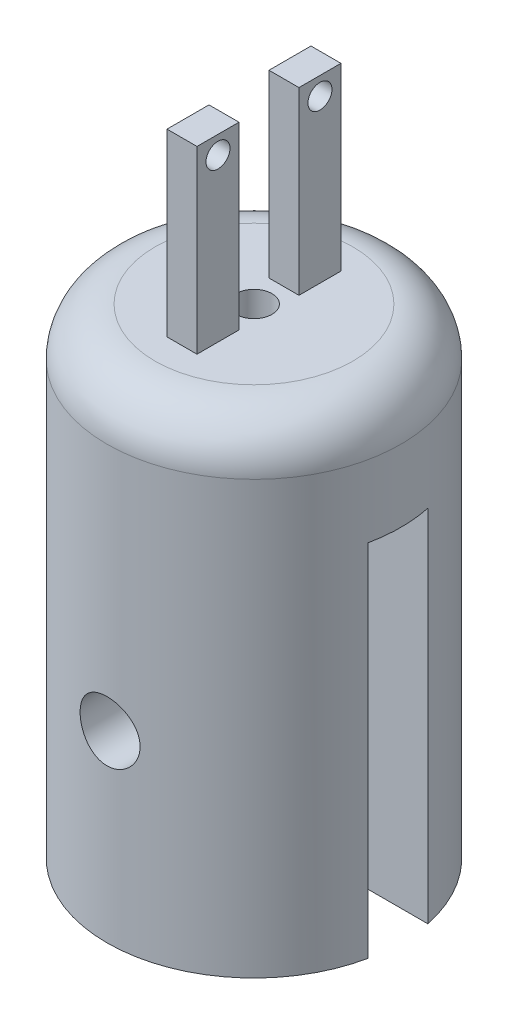
ISO-10303-21;
HEADER;
FILE_DESCRIPTION(('STEP AP214'),'2;1');
FILE_NAME('part.step','',(''),(''),'','','');
FILE_SCHEMA(('AUTOMOTIVE_DESIGN { 1 0 10303 214 1 1 1 1 }'));
ENDSEC;
DATA;
#1=APPLICATION_CONTEXT('core data for automotive mechanical design processes');
#2=APPLICATION_PROTOCOL_DEFINITION('international standard','automotive_design',2000,#1);
#3=PRODUCT_CONTEXT('',#1,'mechanical');
#4=PRODUCT('Part','Part','',(#3));
#5=PRODUCT_RELATED_PRODUCT_CATEGORY('part','',(#4));
#6=PRODUCT_DEFINITION_FORMATION('','',#4);
#7=PRODUCT_DEFINITION_CONTEXT('part definition',#1,'design');
#8=PRODUCT_DEFINITION('design','',#6,#7);
#9=PRODUCT_DEFINITION_SHAPE('','',#8);
#10=(LENGTH_UNIT() NAMED_UNIT(*) SI_UNIT(.MILLI.,.METRE.));
#11=(NAMED_UNIT(*) PLANE_ANGLE_UNIT() SI_UNIT($,.RADIAN.));
#12=(NAMED_UNIT(*) SI_UNIT($,.STERADIAN.) SOLID_ANGLE_UNIT());
#13=UNCERTAINTY_MEASURE_WITH_UNIT(LENGTH_MEASURE(1.E-05),#10,'distance_accuracy_value','');
#14=(GEOMETRIC_REPRESENTATION_CONTEXT(3) GLOBAL_UNCERTAINTY_ASSIGNED_CONTEXT((#13)) GLOBAL_UNIT_ASSIGNED_CONTEXT((#10,
#11,#12)) REPRESENTATION_CONTEXT('',''));
#15=CARTESIAN_POINT('',(0.,0.,0.));
#16=DIRECTION('',(0.,0.,1.));
#17=DIRECTION('',(1.,0.,0.));
#18=AXIS2_PLACEMENT_3D('',#15,#16,#17);
#19=CARTESIAN_POINT('',(0.,80.,0.));
#20=DIRECTION('',(0.,1.,0.));
#21=DIRECTION('',(0.,0.,1.));
#22=AXIS2_PLACEMENT_3D('',#19,#20,#21);
#23=PLANE('',#22);
#24=DIRECTION('',(0.,0.,-1.));
#25=VECTOR('',#24,1.);
#26=CARTESIAN_POINT('',(-2.5,80.,5.));
#27=LINE('',#26,#25);
#28=CARTESIAN_POINT('',(-2.5,80.,12.));
#29=VERTEX_POINT('',#28);
#30=CARTESIAN_POINT('',(-2.5,80.,5.));
#31=VERTEX_POINT('',#30);
#32=EDGE_CURVE('E130',#29,#31,#27,.T.);
#33=ORIENTED_EDGE('',*,*,#32,.T.);
#34=DIRECTION('',(1.,0.,0.));
#35=VECTOR('',#34,1.);
#36=CARTESIAN_POINT('',(-2.5,80.,5.));
#37=LINE('',#36,#35);
#38=CARTESIAN_POINT('',(2.5,80.,5.));
#39=VERTEX_POINT('',#38);
#40=EDGE_CURVE('E144',#31,#39,#37,.T.);
#41=ORIENTED_EDGE('',*,*,#40,.T.);
#42=DIRECTION('',(0.,0.,1.));
#43=VECTOR('',#42,1.);
#44=CARTESIAN_POINT('',(2.5,80.,5.));
#45=LINE('',#44,#43);
#46=CARTESIAN_POINT('',(2.5,80.,12.));
#47=VERTEX_POINT('',#46);
#48=EDGE_CURVE('E57',#39,#47,#45,.T.);
#49=ORIENTED_EDGE('',*,*,#48,.T.);
#50=DIRECTION('',(-1.,0.,0.));
#51=VECTOR('',#50,1.);
#52=CARTESIAN_POINT('',(-2.5,80.,12.));
#53=LINE('',#52,#51);
#54=EDGE_CURVE('E52',#47,#29,#53,.T.);
#55=ORIENTED_EDGE('',*,*,#54,.T.);
#56=EDGE_LOOP('',(#33,#41,#49,#55));
#57=FACE_BOUND('',#56,.T.);
#58=CARTESIAN_POINT('',(0.,80.,0.));
#59=DIRECTION('',(0.,1.,0.));
#60=DIRECTION('',(0.,0.,1.));
#61=AXIS2_PLACEMENT_3D('',#58,#59,#60);
#62=CIRCLE('',#61,3.);
#63=CARTESIAN_POINT('',(0.,80.,3.));
#64=VERTEX_POINT('',#63);
#65=EDGE_CURVE('E195',#64,#64,#62,.T.);
#66=ORIENTED_EDGE('',*,*,#65,.F.);
#67=EDGE_LOOP('',(#66));
#68=FACE_BOUND('',#67,.T.);
#69=CARTESIAN_POINT('',(0.,80.,0.));
#70=DIRECTION('',(0.,1.,0.));
#71=DIRECTION('',(0.,0.,1.));
#72=AXIS2_PLACEMENT_3D('',#69,#70,#71);
#73=CIRCLE('',#72,16.5);
#74=CARTESIAN_POINT('',(0.,80.,16.5));
#75=VERTEX_POINT('',#74);
#76=EDGE_CURVE('E225',#75,#75,#73,.T.);
#77=ORIENTED_EDGE('',*,*,#76,.T.);
#78=EDGE_LOOP('',(#77));
#79=FACE_BOUND('',#78,.T.);
#80=DIRECTION('',(1.,0.,0.));
#81=VECTOR('',#80,1.);
#82=CARTESIAN_POINT('',(-2.5,80.,-5.));
#83=LINE('',#82,#81);
#84=CARTESIAN_POINT('',(-2.5,80.,-5.));
#85=VERTEX_POINT('',#84);
#86=CARTESIAN_POINT('',(2.5,80.,-5.));
#87=VERTEX_POINT('',#86);
#88=EDGE_CURVE('E180',#85,#87,#83,.T.);
#89=ORIENTED_EDGE('',*,*,#88,.F.);
#90=DIRECTION('',(0.,0.,1.));
#91=VECTOR('',#90,1.);
#92=CARTESIAN_POINT('',(-2.5,80.,-5.));
#93=LINE('',#92,#91);
#94=CARTESIAN_POINT('',(-2.5,80.,-12.));
#95=VERTEX_POINT('',#94);
#96=EDGE_CURVE('E177',#95,#85,#93,.T.);
#97=ORIENTED_EDGE('',*,*,#96,.F.);
#98=DIRECTION('',(-1.,0.,0.));
#99=VECTOR('',#98,1.);
#100=CARTESIAN_POINT('',(-2.5,80.,-12.));
#101=LINE('',#100,#99);
#102=CARTESIAN_POINT('',(2.5,80.,-12.));
#103=VERTEX_POINT('',#102);
#104=EDGE_CURVE('E170',#103,#95,#101,.T.);
#105=ORIENTED_EDGE('',*,*,#104,.F.);
#106=DIRECTION('',(0.,0.,-1.));
#107=VECTOR('',#106,1.);
#108=CARTESIAN_POINT('',(2.5,80.,-5.));
#109=LINE('',#108,#107);
#110=EDGE_CURVE('E182',#87,#103,#109,.T.);
#111=ORIENTED_EDGE('',*,*,#110,.F.);
#112=EDGE_LOOP('',(#89,#97,#105,#111));
#113=FACE_BOUND('',#112,.T.);
#114=ADVANCED_FACE('F35',(#57,#68,#79,#113),#23,.T.);
#115=CARTESIAN_POINT('',(0.,80.,0.));
#116=DIRECTION('',(0.,-1.,0.));
#117=DIRECTION('',(0.,0.,-1.));
#118=AXIS2_PLACEMENT_3D('',#115,#116,#117);
#119=CYLINDRICAL_SURFACE('',#118,24.5);
#120=CARTESIAN_POINT('',(0.,35.57,-24.5));
#121=CARTESIAN_POINT('',(-0.138927094691041,35.5700028592022,-24.5000014764726));
#122=CARTESIAN_POINT('',(-0.277818744280451,35.5642083292908,-24.4988162973987));
#123=CARTESIAN_POINT('',(-0.554642589428666,35.5410818382895,-24.4941118465682));
#124=CARTESIAN_POINT('',(-0.692574602962235,35.5237477455675,-24.4905921435699));
#125=CARTESIAN_POINT('',(-0.966505720383131,35.4776645513688,-24.4813125826295));
#126=CARTESIAN_POINT('',(-1.10250384016258,35.4489098394028,-24.4755516236775));
#127=CARTESIAN_POINT('',(-1.37158796318948,35.3802010460337,-24.4619480034038));
#128=CARTESIAN_POINT('',(-1.50467287632139,35.3402428470112,-24.4541045767687));
#129=CARTESIAN_POINT('',(-1.76676806236914,35.249501817156,-24.436566048711));
#130=CARTESIAN_POINT('',(-1.89578363712136,35.1987338008121,-24.4268734833423));
#131=CARTESIAN_POINT('',(-2.14909431066194,35.0867001632099,-24.4058917710595));
#132=CARTESIAN_POINT('',(-2.27338764787567,35.0254306705734,-24.3946020356164));
#133=CARTESIAN_POINT('',(-2.51631455034081,34.892880833122,-24.3707417328443));
#134=CARTESIAN_POINT('',(-2.63495058326167,34.8216049075422,-24.3581717316004));
#135=CARTESIAN_POINT('',(-2.86588000793839,34.6694945895268,-24.3320825582598));
#136=CARTESIAN_POINT('',(-2.97817100739644,34.5886566269394,-24.3185630324118));
#137=CARTESIAN_POINT('',(-3.19695962959707,34.4169498005349,-24.2907752007784));
#138=CARTESIAN_POINT('',(-3.30336947418976,34.3259702279187,-24.2764997532354));
#139=CARTESIAN_POINT('',(-3.50821247878026,34.1353924390404,-24.2477452311264));
#140=CARTESIAN_POINT('',(-3.60664266800269,34.0357910412032,-24.2332660830567));
#141=CARTESIAN_POINT('',(-3.79479236215388,33.8286984930855,-24.2045162725873));
#142=CARTESIAN_POINT('',(-3.88451435106679,33.7212096081371,-24.190245551727));
#143=CARTESIAN_POINT('',(-4.05469560057424,33.4989997097404,-24.1623029369191));
#144=CARTESIAN_POINT('',(-4.13515143244166,33.3842760433738,-24.148631265788));
#145=CARTESIAN_POINT('',(-4.28689310747993,33.1473069515512,-24.122158725797));
#146=CARTESIAN_POINT('',(-4.35808820527605,33.0250022539705,-24.109366980361));
#147=CARTESIAN_POINT('',(-4.48992363251295,32.7746851332047,-24.0851626522282));
#148=CARTESIAN_POINT('',(-4.55055999989192,32.6466705899919,-24.0737505877323));
#149=CARTESIAN_POINT('',(-4.71582535517314,32.2554961878267,-24.0421242614682));
#150=CARTESIAN_POINT('',(-4.80399508441736,31.984917164341,-24.0244863951867));
#151=CARTESIAN_POINT('',(-4.9323490185101,31.4362262433694,-23.9984623215732));
#152=CARTESIAN_POINT('',(-4.97317067582927,31.1582672175011,-23.9899533313089));
#153=CARTESIAN_POINT('',(-5.00774249215697,30.5992863003403,-23.9827615421265));
#154=CARTESIAN_POINT('',(-5.00149766739469,30.3182647386329,-23.9840776960687));
#155=CARTESIAN_POINT('',(-4.94260278714393,29.765854376771,-23.9962814911304));
#156=CARTESIAN_POINT('',(-4.89068442200202,29.4943835840185,-24.00701820772));
#157=CARTESIAN_POINT('',(-4.74307866873316,28.9640853771568,-24.0366141367175));
#158=CARTESIAN_POINT('',(-4.64738911274848,28.7052585899706,-24.0554737514258));
#159=CARTESIAN_POINT('',(-4.41426261071955,28.2055013017009,-24.0993439484245));
#160=CARTESIAN_POINT('',(-4.2765375151849,27.9647090802306,-24.1243967517326));
#161=CARTESIAN_POINT('',(-3.96345306929938,27.5093792391972,-24.1778035624238));
#162=CARTESIAN_POINT('',(-3.78808922307917,27.2948447608774,-24.2061579639906));
#163=CARTESIAN_POINT('',(-3.40079730339449,26.8939008973363,-24.2636256176444));
#164=CARTESIAN_POINT('',(-3.18824528791539,26.7080942969021,-24.292743129691));
#165=CARTESIAN_POINT('',(-2.73467922207017,26.3746750840182,-24.3479699126631));
#166=CARTESIAN_POINT('',(-2.4936647773062,26.2270630009122,-24.3740791418936));
#167=CARTESIAN_POINT('',(-1.98933186888398,25.9741036721555,-24.4204158445337));
#168=CARTESIAN_POINT('',(-1.72597681353677,25.8688274525639,-24.4406334181132));
#169=CARTESIAN_POINT('',(-1.18481320306257,25.7041823475231,-24.4728340679864));
#170=CARTESIAN_POINT('',(-0.907006477108038,25.6448076672542,-24.484818183688));
#171=CARTESIAN_POINT('',(-0.350003377842166,25.5745093803965,-24.4990562051537));
#172=CARTESIAN_POINT('',(-0.0709151791141877,25.5627611799464,-24.5014756921779));
#173=CARTESIAN_POINT('',(0.485236190463291,25.5858256016683,-24.4967726244774));
#174=CARTESIAN_POINT('',(0.762299479106051,25.6206354934299,-24.4896506293152));
#175=CARTESIAN_POINT('',(1.30386085463528,25.7351431266972,-24.4667686320952));
#176=CARTESIAN_POINT('',(1.56845258336614,25.8144157830914,-24.4510904688367));
#177=CARTESIAN_POINT('',(2.08058737994473,26.015132705376,-24.4128482525639));
#178=CARTESIAN_POINT('',(2.32812912999591,26.1365802265975,-24.390283668027));
#179=CARTESIAN_POINT('',(2.80260055657824,26.4199691223475,-24.3403599107688));
#180=CARTESIAN_POINT('',(3.0292290845,26.5824044144471,-24.3129435726736));
#181=CARTESIAN_POINT('',(3.4523076081673,26.9424999128215,-24.2564879881501));
#182=CARTESIAN_POINT('',(3.64875422060733,27.1401640627928,-24.2274485602752));
#183=CARTESIAN_POINT('',(4.00909180962205,27.5688629585039,-24.1704584705477));
#184=CARTESIAN_POINT('',(4.17241562109737,27.8003782322776,-24.1425324546264));
#185=CARTESIAN_POINT('',(4.45785904295759,28.2880517914195,-24.0914634329602));
#186=CARTESIAN_POINT('',(4.57998033601114,28.5442090698842,-24.0683202319048));
#187=CARTESIAN_POINT('',(4.77879231716162,29.0725287660103,-24.029635797035));
#188=CARTESIAN_POINT('',(4.85572344197731,29.3445978510058,-24.0140544087063));
#189=CARTESIAN_POINT('',(4.96268020933427,29.8983123304613,-23.9921842453168));
#190=CARTESIAN_POINT('',(4.99271225463982,30.1799564123565,-23.9858942017876));
#191=CARTESIAN_POINT('',(5.00183412579818,30.6002589184671,-23.9839850414354));
#192=CARTESIAN_POINT('',(4.9990712097101,30.7387396937784,-23.9845643887607));
#193=CARTESIAN_POINT('',(4.98208019203428,31.0149513714852,-23.9881009184022));
#194=CARTESIAN_POINT('',(4.96785644779947,31.1526825388461,-23.9910571970195));
#195=CARTESIAN_POINT('',(4.92804499552794,31.4264611768382,-23.999266146514));
#196=CARTESIAN_POINT('',(4.90245332201172,31.5625080428973,-24.0045196187124));
#197=CARTESIAN_POINT('',(4.84012177233547,31.8318722568431,-24.017165384348));
#198=CARTESIAN_POINT('',(4.8033858691224,31.9651905594188,-24.0245569155182));
#199=CARTESIAN_POINT('',(4.71914246240962,32.2279151165449,-24.041246460658));
#200=CARTESIAN_POINT('',(4.67165988668527,32.3573296511157,-24.0505400579302));
#201=CARTESIAN_POINT('',(4.56624924075806,32.6116434429965,-24.07077574865));
#202=CARTESIAN_POINT('',(4.50832486046888,32.7365442766957,-24.0817172595356));
#203=CARTESIAN_POINT('',(4.38241080354131,32.9810991515731,-24.1049491476778));
#204=CARTESIAN_POINT('',(4.31441692121477,33.1007509732198,-24.1172400879876));
#205=CARTESIAN_POINT('',(4.16888258814234,33.3339283783887,-24.142822380248));
#206=CARTESIAN_POINT('',(4.09134540292377,33.447456038457,-24.1561133893932));
#207=CARTESIAN_POINT('',(3.92574901414531,33.6696840161423,-24.18358250611));
#208=CARTESIAN_POINT('',(3.83752518474707,33.7782602528297,-24.1977722937296));
#209=CARTESIAN_POINT('',(3.65234623613038,33.9875850593388,-24.2264140814968));
#210=CARTESIAN_POINT('',(3.55539418778792,34.0883363591727,-24.2408659880045));
#211=CARTESIAN_POINT('',(3.35332512605612,34.2814352450307,-24.269644187054));
#212=CARTESIAN_POINT('',(3.24820331535755,34.3737778232577,-24.2839704002095));
#213=CARTESIAN_POINT('',(3.03058919604741,34.5493298209395,-24.3120866888451));
#214=CARTESIAN_POINT('',(2.91809961242228,34.6325425869527,-24.3258769595713));
#215=CARTESIAN_POINT('',(2.68514756581195,34.7901878545419,-24.3526976162421));
#216=CARTESIAN_POINT('',(2.56460892140556,34.8645096248866,-24.3657175652357));
#217=CARTESIAN_POINT('',(2.31760650666049,35.0026876637999,-24.3904509933865));
#218=CARTESIAN_POINT('',(2.19114493416003,35.0665477754572,-24.4021649517917));
#219=CARTESIAN_POINT('',(1.93321207454402,35.1833193628907,-24.4239518238109));
#220=CARTESIAN_POINT('',(1.8017438131856,35.236237330932,-24.4340257097648));
#221=CARTESIAN_POINT('',(1.53471428575054,35.3307477306037,-24.4522509673096));
#222=CARTESIAN_POINT('',(1.39915380137499,35.3723423102223,-24.4604027034833));
#223=CARTESIAN_POINT('',(1.05645121011035,35.4617263944715,-24.4780752457162));
#224=CARTESIAN_POINT('',(0.847304024589248,35.502272564655,-24.4862537360052));
#225=CARTESIAN_POINT('',(0.425410125130095,35.5564067170554,-24.4972148906169));
#226=CARTESIAN_POINT('',(0.212663534817133,35.569995623258,-24.4999977398802));
#227=CARTESIAN_POINT('',(0.,35.57,-24.5));
#228=B_SPLINE_CURVE_WITH_KNOTS('',3,(#120,#121,#122,#123,#124,#125,#126,#127,#128,#129,#130,
#131,#132,#133,#134,#135,#136,#137,#138,#139,#140,#141,#142,#143,#144,#145,#146,#147,#148,#149,
#150,#151,#152,#153,#154,#155,#156,#157,#158,#159,#160,#161,#162,#163,#164,#165,#166,#167,#168,
#169,#170,#171,#172,#173,#174,#175,#176,#177,#178,#179,#180,#181,#182,#183,#184,#185,#186,#187,
#188,#189,#190,#191,#192,#193,#194,#195,#196,#197,#198,#199,#200,#201,#202,#203,#204,#205,#206,
#207,#208,#209,#210,#211,#212,#213,#214,#215,#216,#217,#218,#219,#220,#221,#222,#223,#224,#225,
#226,#227),.UNSPECIFIED.,.T.,.F.,(4,2,2,2,2,2,2,2,2,2,2,2,2,2,2,2,2,2,2,2,2,2,2,2,2,2,2,2,2,2,2,
2,2,2,2,2,2,2,2,2,2,2,2,2,2,2,2,2,2,2,2,2,2,4),(0.,0.416594504688223,0.833265985670308,
1.25014241422477,1.66717225873678,2.08363421478996,2.50025003141825,2.9166824295262,
3.33327080357858,3.75496036745213,4.17680620954459,4.59853136572381,5.02041207355789,
5.44615711289273,5.87206156629022,6.72285181415668,7.56204971668844,8.40115818084931,
9.22706403167339,10.0530107916031,10.8847515773284,11.7165917680808,12.5640293536971,
13.4114786834545,14.2603438899074,15.1091019142383,15.9431003052891,16.7770497884504,
17.6031589832907,18.4293319568065,19.2659804091366,20.1027225790206,20.9527660774774,
21.8027748568254,22.6482191666779,23.493548044542,23.9086708866234,24.3236359753833,
24.7387459304,25.1537080712007,25.5677173632094,25.9815806388394,26.3956172611332,
26.8095126002117,27.2308768860665,27.6520934971281,28.0735593443185,28.4948701822124,
28.9209769347491,29.3469268043235,29.7726232166892,30.1982388202873,30.8359653700628,
31.4736700607815),.UNSPECIFIED.);
#229=CARTESIAN_POINT('',(0.,35.57,-24.5));
#230=VERTEX_POINT('',#229);
#231=EDGE_CURVE('E237',#230,#230,#228,.T.);
#232=ORIENTED_EDGE('',*,*,#231,.T.);
#233=EDGE_LOOP('',(#232));
#234=FACE_BOUND('',#233,.T.);
#235=CARTESIAN_POINT('',(5.,30.57,23.9843699104229));
#236=CARTESIAN_POINT('',(5.00000287031204,30.4311067880227,23.9843683164881));
#237=CARTESIAN_POINT('',(4.99421113527899,30.2922490351051,23.9855786307056));
#238=CARTESIAN_POINT('',(4.97109609504833,30.015493912437,23.9903804718701));
#239=CARTESIAN_POINT('',(4.95377065590898,29.8775967251799,23.9939724394651));
#240=CARTESIAN_POINT('',(4.90771111898821,29.6037359746018,24.003435586374));
#241=CARTESIAN_POINT('',(4.87897135749194,29.4677734059702,24.0093078971477));
#242=CARTESIAN_POINT('',(4.81029945110373,29.1987611709007,24.0231606132268));
#243=CARTESIAN_POINT('',(4.77036318434047,29.0657125967022,24.0311417948276));
#244=CARTESIAN_POINT('',(4.67967510731973,28.8036947472973,24.0489661116341));
#245=CARTESIAN_POINT('',(4.62893854881608,28.6747200110896,24.0588066189922));
#246=CARTESIAN_POINT('',(4.5169754628336,28.4214875988056,24.0800784625353));
#247=CARTESIAN_POINT('',(4.45574506526056,28.2972316837422,24.0915103853361));
#248=CARTESIAN_POINT('',(4.32327944568266,28.054373111214,24.1156335733153));
#249=CARTESIAN_POINT('',(4.25204860336977,27.9357680092699,24.1283242864965));
#250=CARTESIAN_POINT('',(4.10003266827963,27.7048921726436,24.1546203050691));
#251=CARTESIAN_POINT('',(4.01924400610569,27.5926238277087,24.1682259513212));
#252=CARTESIAN_POINT('',(3.84758698031475,27.3738056194171,24.1961511395995));
#253=CARTESIAN_POINT('',(3.75660246748283,27.2673477390398,24.2104776069987));
#254=CARTESIAN_POINT('',(3.56600462660314,27.0624081134423,24.2392842638956));
#255=CARTESIAN_POINT('',(3.46638811259692,26.9639293393786,24.2537645084052));
#256=CARTESIAN_POINT('',(3.25925562197385,26.7756844302855,24.2824664576735));
#257=CARTESIAN_POINT('',(3.15174197589191,26.6859157428151,24.2966882371749));
#258=CARTESIAN_POINT('',(2.92947288516401,26.5156444974405,24.324488484682));
#259=CARTESIAN_POINT('',(2.8147147865828,26.4351453662063,24.3380667137025));
#260=CARTESIAN_POINT('',(2.57771724515427,26.2833536943518,24.3643118474148));
#261=CARTESIAN_POINT('',(2.45542113788268,26.2121478529483,24.3769697407805));
#262=CARTESIAN_POINT('',(2.20512011512136,26.0802900389384,24.4008874822613));
#263=CARTESIAN_POINT('',(2.07711307951964,26.0196420274496,24.4121468052046));
#264=CARTESIAN_POINT('',(1.68596126221837,25.8543411806531,24.4433132310557));
#265=CARTESIAN_POINT('',(1.41539864565885,25.7661478186252,24.4606417586859));
#266=CARTESIAN_POINT('',(0.866773244548727,25.6377490945213,24.4861835000912));
#267=CARTESIAN_POINT('',(0.588864036984934,25.5969027191187,24.4945183660633));
#268=CARTESIAN_POINT('',(0.0299818092546762,25.5622641577462,24.5015736192865));
#269=CARTESIAN_POINT('',(-0.250990901206434,25.5684672585462,24.5002949695816));
#270=CARTESIAN_POINT('',(-0.803577192131904,25.6272930850394,24.4883557685608));
#271=CARTESIAN_POINT('',(-1.07526776927765,25.6792262793228,24.4778345843826));
#272=CARTESIAN_POINT('',(-1.6059977573131,25.8269367293049,24.4487513908128));
#273=CARTESIAN_POINT('',(-1.86503664696114,25.9227157897425,24.430189050441));
#274=CARTESIAN_POINT('',(-2.36506252464143,26.1560335052328,24.3868803469086));
#275=CARTESIAN_POINT('',(-2.60592077234362,26.2938404181068,24.3620944446702));
#276=CARTESIAN_POINT('',(-3.06134859720679,26.607102724614,24.3090680433033));
#277=CARTESIAN_POINT('',(-3.27591502623854,26.7825626198324,24.2808271312864));
#278=CARTESIAN_POINT('',(-3.67676176122547,27.1699266662662,24.2234025961596));
#279=CARTESIAN_POINT('',(-3.86245828860777,27.3824342321867,24.1942111653571));
#280=CARTESIAN_POINT('',(-4.19567604662687,27.8358708216587,24.1386603723479));
#281=CARTESIAN_POINT('',(-4.343196494427,28.0768004278837,24.1123010682233));
#282=CARTESIAN_POINT('',(-4.5960879436222,28.5811025080727,24.0653825020964));
#283=CARTESIAN_POINT('',(-4.70136112519516,28.844525373792,24.0448367328648));
#284=CARTESIAN_POINT('',(-4.86597976406629,29.3858374812179,24.0120669177334));
#285=CARTESIAN_POINT('',(-4.9253314770358,29.6637247469991,23.9998417383851));
#286=CARTESIAN_POINT('',(-4.99554298856658,30.2207773271084,23.9853252377806));
#287=CARTESIAN_POINT('',(-5.00724728283665,30.4998318115329,23.9828609376556));
#288=CARTESIAN_POINT('',(-4.98410710282828,31.0559055346767,23.987680413684));
#289=CARTESIAN_POINT('',(-4.94926538426934,31.3329248929076,23.9949636127446));
#290=CARTESIAN_POINT('',(-4.83475127606536,31.8742048696097,24.0182951758056));
#291=CARTESIAN_POINT('',(-4.75553303096808,32.1385657459594,24.0342546991666));
#292=CARTESIAN_POINT('',(-4.55500139154479,32.6502626646445,24.073062299938));
#293=CARTESIAN_POINT('',(-4.43368440841965,32.8975972533818,24.0959109646067));
#294=CARTESIAN_POINT('',(-4.15049846564737,33.3719074245406,24.1463091963637));
#295=CARTESIAN_POINT('',(-3.98810281422004,33.5985621039516,24.1739182093712));
#296=CARTESIAN_POINT('',(-3.62806767643758,34.0217115831825,24.2305645073036));
#297=CARTESIAN_POINT('',(-3.43042440578403,34.218203140373,24.2596019453461));
#298=CARTESIAN_POINT('',(-3.00171065011575,34.5786668605631,24.3163967347696));
#299=CARTESIAN_POINT('',(-2.77015495443473,34.7420670191573,24.3441260918958));
#300=CARTESIAN_POINT('',(-2.28237738577488,35.027644271138,24.3946871577373));
#301=CARTESIAN_POINT('',(-2.02615657613214,35.1498231405906,24.4175190774489));
#302=CARTESIAN_POINT('',(-1.49785378139559,35.3486678322095,24.455595754619));
#303=CARTESIAN_POINT('',(-1.22587460330765,35.425598644627,24.4708846004948));
#304=CARTESIAN_POINT('',(-0.672352338599459,35.5325852257849,24.4923335795426));
#305=CARTESIAN_POINT('',(-0.390810458283114,35.5626468846427,24.4984948597847));
#306=CARTESIAN_POINT('',(0.0294578185818548,35.571840659533,24.5003778998617));
#307=CARTESIAN_POINT('',(0.168003765761269,35.5690977919645,24.4998151129379));
#308=CARTESIAN_POINT('',(0.44434795360207,35.552135869253,24.4963584664674));
#309=CARTESIAN_POINT('',(0.582146458218647,35.5379211724691,24.4934654922026));
#310=CARTESIAN_POINT('',(0.856061377218716,35.4981163290979,24.4854234115053));
#311=CARTESIAN_POINT('',(0.992177194474289,35.4725222570801,24.4802735265374));
#312=CARTESIAN_POINT('',(1.26168033768967,35.4101737881419,24.4678635803065));
#313=CARTESIAN_POINT('',(1.39506862000967,35.3734233771757,24.4606042727409));
#314=CARTESIAN_POINT('',(1.65795462757969,35.2891313813696,24.4441914952869));
#315=CARTESIAN_POINT('',(1.78746002111646,35.2416129042145,24.4350420851182));
#316=CARTESIAN_POINT('',(2.04195023382489,35.1361150145816,24.4150921736591));
#317=CARTESIAN_POINT('',(2.16693663409939,35.0781393042364,24.4042922568969));
#318=CARTESIAN_POINT('',(2.41165349388574,34.9521088612283,24.381325628565));
#319=CARTESIAN_POINT('',(2.53138175261763,34.8840499594267,24.3691583521323));
#320=CARTESIAN_POINT('',(2.76470007438014,34.7383740622531,24.3437918488365));
#321=CARTESIAN_POINT('',(2.87829222260844,34.6607603436122,24.330592976313));
#322=CARTESIAN_POINT('',(3.10053299814342,34.4950773852655,24.3032805343235));
#323=CARTESIAN_POINT('',(3.2090637636233,34.4068519521149,24.2891551771405));
#324=CARTESIAN_POINT('',(3.41829623439949,34.2216792428967,24.2605935292818));
#325=CARTESIAN_POINT('',(3.51900067030696,34.1247350345136,24.2461573493178));
#326=CARTESIAN_POINT('',(3.71200641900073,33.9226911490237,24.2173602333125));
#327=CARTESIAN_POINT('',(3.80430266902993,33.8175866280325,24.2029993474475));
#328=CARTESIAN_POINT('',(3.97976413225426,33.6000167391411,24.1747672817949));
#329=CARTESIAN_POINT('',(4.06293268370979,33.4875540865008,24.1608959242405));
#330=CARTESIAN_POINT('',(4.2205190036678,33.2546268097432,24.1338701387341));
#331=CARTESIAN_POINT('',(4.29482290658945,33.1340839091486,24.1207260071028));
#332=CARTESIAN_POINT('',(4.43296505677975,32.8870755092854,24.095720536246));
#333=CARTESIAN_POINT('',(4.4968071471687,32.7606122069092,24.0838587265102));
#334=CARTESIAN_POINT('',(4.61354330725533,32.5026770881362,24.0617694716194));
#335=CARTESIAN_POINT('',(4.66644392449769,32.3712083231888,24.0515410498603));
#336=CARTESIAN_POINT('',(4.76092082566232,32.1041767915785,24.0330177385101));
#337=CARTESIAN_POINT('',(4.80249926726503,31.9686148104425,24.0247224805572));
#338=CARTESIAN_POINT('',(4.891819617289,31.6259995474248,24.0067312977789));
#339=CARTESIAN_POINT('',(4.93233058385396,31.4169432029953,23.9983929039452));
#340=CARTESIAN_POINT('',(4.98641807769568,30.9952301300801,23.9872135322741));
#341=CARTESIAN_POINT('',(4.9999956070396,30.7825735358397,23.9843723499111));
#342=CARTESIAN_POINT('',(5.,30.57,23.9843699104229));
#343=B_SPLINE_CURVE_WITH_KNOTS('',3,(#235,#236,#237,#238,#239,#240,#241,#242,#243,#244,#245,
#246,#247,#248,#249,#250,#251,#252,#253,#254,#255,#256,#257,#258,#259,#260,#261,#262,#263,#264,
#265,#266,#267,#268,#269,#270,#271,#272,#273,#274,#275,#276,#277,#278,#279,#280,#281,#282,#283,
#284,#285,#286,#287,#288,#289,#290,#291,#292,#293,#294,#295,#296,#297,#298,#299,#300,#301,#302,
#303,#304,#305,#306,#307,#308,#309,#310,#311,#312,#313,#314,#315,#316,#317,#318,#319,#320,#321,
#322,#323,#324,#325,#326,#327,#328,#329,#330,#331,#332,#333,#334,#335,#336,#337,#338,#339,#340,
#341,#342),.UNSPECIFIED.,.T.,.F.,(4,2,2,2,2,2,2,2,2,2,2,2,2,2,2,2,2,2,2,2,2,2,2,2,2,2,2,2,2,2,2,
2,2,2,2,2,2,2,2,2,2,2,2,2,2,2,2,2,2,2,2,2,2,4),(0.,0.416492716074513,0.833062512182578,
1.24983926635832,1.66676965427877,2.08311512948347,2.49961448328692,2.91593199703739,
3.33240547953886,3.75422882909918,4.17620853673013,4.5980642097702,5.02007533262015,
5.44577819146088,5.8716404241375,6.72235075738893,7.56140391847064,8.40037302764426,
9.22690447109253,10.0534699384475,10.8854257730249,11.7174811271707,12.5646314222936,
13.4117990876593,14.2609171318933,15.1099194842896,15.9438069472585,16.777645042774,
17.6031016515695,18.4286286455152,19.2653301572271,20.1021215540588,20.9523316288473,
21.8025050666865,22.6476486622237,23.4926860387235,23.9080030359055,24.3231623207496,
24.7384649302313,25.1536193340343,25.5678911369492,25.9820165637082,26.3963137009779,
26.8104691528231,27.231711922684,27.6528070546367,28.074154084336,28.4953464982159,
28.9214706618725,29.34743793728,29.7731495651086,30.1987800077011,30.8362382550597,
31.4736727851353),.UNSPECIFIED.);
#344=CARTESIAN_POINT('',(5.,30.57,23.9843699104229));
#345=VERTEX_POINT('',#344);
#346=EDGE_CURVE('E231',#345,#345,#343,.T.);
#347=ORIENTED_EDGE('',*,*,#346,.T.);
#348=EDGE_LOOP('',(#347));
#349=FACE_BOUND('',#348,.T.);
#350=CARTESIAN_POINT('',(0.,72.,0.));
#351=DIRECTION('',(0.,1.,0.));
#352=DIRECTION('',(0.,0.,1.));
#353=AXIS2_PLACEMENT_3D('',#350,#351,#352);
#354=CIRCLE('',#353,24.5);
#355=CARTESIAN_POINT('',(0.,72.,24.5));
#356=VERTEX_POINT('',#355);
#357=EDGE_CURVE('E228',#356,#356,#354,.F.);
#358=ORIENTED_EDGE('',*,*,#357,.T.);
#359=EDGE_LOOP('',(#358));
#360=FACE_BOUND('',#359,.T.);
#361=DIRECTION('',(0.,-1.,0.));
#362=VECTOR('',#361,1.);
#363=CARTESIAN_POINT('',(23.9843699104229,80.,-5.));
#364=LINE('',#363,#362);
#365=CARTESIAN_POINT('',(23.9843699104229,0.,-5.));
#366=VERTEX_POINT('',#365);
#367=CARTESIAN_POINT('',(23.9843699104229,60.,-5.));
#368=VERTEX_POINT('',#367);
#369=EDGE_CURVE('E217',#366,#368,#364,.F.);
#370=ORIENTED_EDGE('',*,*,#369,.F.);
#371=CARTESIAN_POINT('',(0.,0.,0.));
#372=DIRECTION('',(0.,1.,0.));
#373=DIRECTION('',(0.,0.,1.));
#374=AXIS2_PLACEMENT_3D('',#371,#372,#373);
#375=CIRCLE('',#374,24.5);
#376=CARTESIAN_POINT('',(-23.9843699104229,0.,-5.));
#377=VERTEX_POINT('',#376);
#378=EDGE_CURVE('E224',#366,#377,#375,.T.);
#379=ORIENTED_EDGE('',*,*,#378,.T.);
#380=DIRECTION('',(0.,-1.,0.));
#381=VECTOR('',#380,1.);
#382=CARTESIAN_POINT('',(-23.9843699104229,80.,-5.));
#383=LINE('',#382,#381);
#384=CARTESIAN_POINT('',(-23.9843699104229,60.,-5.));
#385=VERTEX_POINT('',#384);
#386=EDGE_CURVE('E219',#385,#377,#383,.T.);
#387=ORIENTED_EDGE('',*,*,#386,.F.);
#388=CARTESIAN_POINT('',(0.,60.,0.));
#389=DIRECTION('',(0.,-1.,0.));
#390=DIRECTION('',(0.,0.,-1.));
#391=AXIS2_PLACEMENT_3D('',#388,#389,#390);
#392=CIRCLE('',#391,24.5);
#393=CARTESIAN_POINT('',(-23.9843699104229,60.,5.));
#394=VERTEX_POINT('',#393);
#395=EDGE_CURVE('E44',#394,#385,#392,.T.);
#396=ORIENTED_EDGE('',*,*,#395,.F.);
#397=DIRECTION('',(0.,-1.,0.));
#398=VECTOR('',#397,1.);
#399=CARTESIAN_POINT('',(-23.9843699104229,80.,5.));
#400=LINE('',#399,#398);
#401=CARTESIAN_POINT('',(-23.9843699104229,0.,5.));
#402=VERTEX_POINT('',#401);
#403=EDGE_CURVE('E212',#402,#394,#400,.F.);
#404=ORIENTED_EDGE('',*,*,#403,.F.);
#405=CARTESIAN_POINT('',(23.9843699104229,0.,5.));
#406=VERTEX_POINT('',#405);
#407=EDGE_CURVE('E221',#402,#406,#375,.T.);
#408=ORIENTED_EDGE('',*,*,#407,.T.);
#409=DIRECTION('',(0.,-1.,0.));
#410=VECTOR('',#409,1.);
#411=CARTESIAN_POINT('',(23.9843699104229,80.,5.));
#412=LINE('',#411,#410);
#413=CARTESIAN_POINT('',(23.9843699104229,60.,5.));
#414=VERTEX_POINT('',#413);
#415=EDGE_CURVE('E214',#414,#406,#412,.T.);
#416=ORIENTED_EDGE('',*,*,#415,.F.);
#417=EDGE_CURVE('E11',#368,#414,#392,.T.);
#418=ORIENTED_EDGE('',*,*,#417,.F.);
#419=EDGE_LOOP('',(#370,#379,#387,#396,#404,#408,#416,#418));
#420=FACE_BOUND('',#419,.T.);
#421=ADVANCED_FACE('F241',(#234,#349,#360,#420),#119,.T.);
#422=CARTESIAN_POINT('',(0.,0.,0.));
#423=DIRECTION('',(0.,1.,0.));
#424=DIRECTION('',(0.,0.,1.));
#425=AXIS2_PLACEMENT_3D('',#422,#423,#424);
#426=PLANE('',#425);
#427=DIRECTION('',(-1.,0.,0.));
#428=VECTOR('',#427,1.);
#429=CARTESIAN_POINT('',(26.6563617468227,0.,-5.));
#430=LINE('',#429,#428);
#431=EDGE_CURVE('E207',#366,#377,#430,.T.);
#432=ORIENTED_EDGE('',*,*,#431,.T.);
#433=ORIENTED_EDGE('',*,*,#378,.F.);
#434=EDGE_LOOP('',(#432,#433));
#435=FACE_BOUND('',#434,.T.);
#436=ADVANCED_FACE('F256',(#435),#426,.F.);
#437=DIRECTION('',(1.,0.,0.));
#438=VECTOR('',#437,1.);
#439=CARTESIAN_POINT('',(26.6563617468227,0.,5.));
#440=LINE('',#439,#438);
#441=EDGE_CURVE('E203',#402,#406,#440,.T.);
#442=ORIENTED_EDGE('',*,*,#441,.T.);
#443=ORIENTED_EDGE('',*,*,#407,.F.);
#444=EDGE_LOOP('',(#442,#443));
#445=FACE_BOUND('',#444,.T.);
#446=ADVANCED_FACE('F250',(#445),#426,.F.);
#447=CARTESIAN_POINT('',(0.,30.57,-24.5));
#448=DIRECTION('',(0.,0.,1.));
#449=DIRECTION('',(1.,0.,0.));
#450=AXIS2_PLACEMENT_3D('',#447,#448,#449);
#451=CYLINDRICAL_SURFACE('',#450,5.);
#452=ORIENTED_EDGE('',*,*,#231,.F.);
#453=EDGE_LOOP('',(#452));
#454=FACE_BOUND('',#453,.T.);
#455=CARTESIAN_POINT('',(0.,30.57,-5.));
#456=DIRECTION('',(0.,0.,1.));
#457=DIRECTION('',(1.,0.,0.));
#458=AXIS2_PLACEMENT_3D('',#455,#456,#457);
#459=CIRCLE('',#458,5.);
#460=CARTESIAN_POINT('',(5.,30.57,-5.));
#461=VERTEX_POINT('',#460);
#462=EDGE_CURVE('E216',#461,#461,#459,.F.);
#463=ORIENTED_EDGE('',*,*,#462,.F.);
#464=EDGE_LOOP('',(#463));
#465=FACE_BOUND('',#464,.T.);
#466=ADVANCED_FACE('F244',(#454,#465),#451,.F.);
#467=ORIENTED_EDGE('',*,*,#346,.F.);
#468=EDGE_LOOP('',(#467));
#469=FACE_BOUND('',#468,.T.);
#470=CARTESIAN_POINT('',(0.,30.57,5.));
#471=DIRECTION('',(0.,0.,-1.));
#472=DIRECTION('',(-1.,0.,0.));
#473=AXIS2_PLACEMENT_3D('',#470,#471,#472);
#474=CIRCLE('',#473,5.);
#475=CARTESIAN_POINT('',(-5.,30.57,5.));
#476=VERTEX_POINT('',#475);
#477=EDGE_CURVE('E206',#476,#476,#474,.F.);
#478=ORIENTED_EDGE('',*,*,#477,.F.);
#479=EDGE_LOOP('',(#478));
#480=FACE_BOUND('',#479,.T.);
#481=ADVANCED_FACE('F249',(#469,#480),#451,.F.);
#482=CARTESIAN_POINT('',(0.,72.,0.));
#483=DIRECTION('',(0.,1.,0.));
#484=DIRECTION('',(0.,0.,1.));
#485=AXIS2_PLACEMENT_3D('',#482,#483,#484);
#486=TOROIDAL_SURFACE('',#485,16.5,8.);
#487=ORIENTED_EDGE('',*,*,#357,.F.);
#488=EDGE_LOOP('',(#487));
#489=FACE_BOUND('',#488,.T.);
#490=ORIENTED_EDGE('',*,*,#76,.F.);
#491=EDGE_LOOP('',(#490));
#492=FACE_BOUND('',#491,.T.);
#493=ADVANCED_FACE('F37',(#489,#492),#486,.T.);
#494=CARTESIAN_POINT('',(0.,60.,0.));
#495=DIRECTION('',(0.,-1.,0.));
#496=DIRECTION('',(0.,0.,-1.));
#497=AXIS2_PLACEMENT_3D('',#494,#495,#496);
#498=PLANE('',#497);
#499=CARTESIAN_POINT('',(0.,60.,0.));
#500=DIRECTION('',(0.,-1.,0.));
#501=DIRECTION('',(0.,0.,-1.));
#502=AXIS2_PLACEMENT_3D('',#499,#500,#501);
#503=CIRCLE('',#502,3.);
#504=CARTESIAN_POINT('',(0.,60.,-3.));
#505=VERTEX_POINT('',#504);
#506=EDGE_CURVE('E198',#505,#505,#503,.T.);
#507=ORIENTED_EDGE('',*,*,#506,.F.);
#508=EDGE_LOOP('',(#507));
#509=FACE_BOUND('',#508,.T.);
#510=ORIENTED_EDGE('',*,*,#417,.T.);
#511=DIRECTION('',(1.,0.,0.));
#512=VECTOR('',#511,1.);
#513=CARTESIAN_POINT('',(26.6563617468227,60.,5.));
#514=LINE('',#513,#512);
#515=EDGE_CURVE('E202',#394,#414,#514,.T.);
#516=ORIENTED_EDGE('',*,*,#515,.F.);
#517=ORIENTED_EDGE('',*,*,#395,.T.);
#518=DIRECTION('',(-1.,0.,0.));
#519=VECTOR('',#518,1.);
#520=CARTESIAN_POINT('',(26.6563617468227,60.,-5.));
#521=LINE('',#520,#519);
#522=EDGE_CURVE('E199',#368,#385,#521,.T.);
#523=ORIENTED_EDGE('',*,*,#522,.F.);
#524=EDGE_LOOP('',(#510,#516,#517,#523));
#525=FACE_BOUND('',#524,.T.);
#526=ADVANCED_FACE('F276',(#509,#525),#498,.T.);
#527=CARTESIAN_POINT('',(26.6563617468227,60.,-5.));
#528=DIRECTION('',(0.,0.,1.));
#529=DIRECTION('',(1.,0.,0.));
#530=AXIS2_PLACEMENT_3D('',#527,#528,#529);
#531=PLANE('',#530);
#532=ORIENTED_EDGE('',*,*,#462,.T.);
#533=EDGE_LOOP('',(#532));
#534=FACE_BOUND('',#533,.T.);
#535=ORIENTED_EDGE('',*,*,#386,.T.);
#536=ORIENTED_EDGE('',*,*,#431,.F.);
#537=ORIENTED_EDGE('',*,*,#369,.T.);
#538=ORIENTED_EDGE('',*,*,#522,.T.);
#539=EDGE_LOOP('',(#535,#536,#537,#538));
#540=FACE_BOUND('',#539,.T.);
#541=ADVANCED_FACE('F252',(#534,#540),#531,.T.);
#542=CARTESIAN_POINT('',(26.6563617468227,60.,5.));
#543=DIRECTION('',(0.,0.,-1.));
#544=DIRECTION('',(-1.,0.,0.));
#545=AXIS2_PLACEMENT_3D('',#542,#543,#544);
#546=PLANE('',#545);
#547=ORIENTED_EDGE('',*,*,#477,.T.);
#548=EDGE_LOOP('',(#547));
#549=FACE_BOUND('',#548,.T.);
#550=ORIENTED_EDGE('',*,*,#415,.T.);
#551=ORIENTED_EDGE('',*,*,#441,.F.);
#552=ORIENTED_EDGE('',*,*,#403,.T.);
#553=ORIENTED_EDGE('',*,*,#515,.T.);
#554=EDGE_LOOP('',(#550,#551,#552,#553));
#555=FACE_BOUND('',#554,.T.);
#556=ADVANCED_FACE('F321',(#549,#555),#546,.T.);
#557=CARTESIAN_POINT('',(0.,20.,0.));
#558=DIRECTION('',(0.,1.,0.));
#559=DIRECTION('',(0.,0.,1.));
#560=AXIS2_PLACEMENT_3D('',#557,#558,#559);
#561=CYLINDRICAL_SURFACE('',#560,3.);
#562=ORIENTED_EDGE('',*,*,#506,.T.);
#563=EDGE_LOOP('',(#562));
#564=FACE_BOUND('',#563,.T.);
#565=ORIENTED_EDGE('',*,*,#65,.T.);
#566=EDGE_LOOP('',(#565));
#567=FACE_BOUND('',#566,.T.);
#568=ADVANCED_FACE('F317',(#564,#567),#561,.F.);
#569=CARTESIAN_POINT('',(-2.5,110.,-5.));
#570=DIRECTION('',(1.,0.,0.));
#571=DIRECTION('',(0.,0.,-1.));
#572=AXIS2_PLACEMENT_3D('',#569,#570,#571);
#573=PLANE('',#572);
#574=CARTESIAN_POINT('',(-2.5,107.,-8.5));
#575=DIRECTION('',(-1.,0.,0.));
#576=DIRECTION('',(0.,0.,1.));
#577=AXIS2_PLACEMENT_3D('',#574,#575,#576);
#578=CIRCLE('',#577,2.);
#579=CARTESIAN_POINT('',(-2.5,107.,-6.5));
#580=VERTEX_POINT('',#579);
#581=EDGE_CURVE('E133',#580,#580,#578,.T.);
#582=ORIENTED_EDGE('',*,*,#581,.F.);
#583=EDGE_LOOP('',(#582));
#584=FACE_BOUND('',#583,.T.);
#585=ORIENTED_EDGE('',*,*,#96,.T.);
#586=DIRECTION('',(0.,-1.,0.));
#587=VECTOR('',#586,1.);
#588=CARTESIAN_POINT('',(-2.5,110.,-5.));
#589=LINE('',#588,#587);
#590=CARTESIAN_POINT('',(-2.5,110.,-5.));
#591=VERTEX_POINT('',#590);
#592=EDGE_CURVE('E193',#591,#85,#589,.T.);
#593=ORIENTED_EDGE('',*,*,#592,.F.);
#594=DIRECTION('',(0.,0.,1.));
#595=VECTOR('',#594,1.);
#596=CARTESIAN_POINT('',(-2.5,110.,-5.));
#597=LINE('',#596,#595);
#598=CARTESIAN_POINT('',(-2.5,110.,-12.));
#599=VERTEX_POINT('',#598);
#600=EDGE_CURVE('E166',#599,#591,#597,.T.);
#601=ORIENTED_EDGE('',*,*,#600,.F.);
#602=DIRECTION('',(0.,-1.,0.));
#603=VECTOR('',#602,1.);
#604=CARTESIAN_POINT('',(-2.5,110.,-12.));
#605=LINE('',#604,#603);
#606=EDGE_CURVE('E176',#599,#95,#605,.T.);
#607=ORIENTED_EDGE('',*,*,#606,.T.);
#608=EDGE_LOOP('',(#585,#593,#601,#607));
#609=FACE_BOUND('',#608,.T.);
#610=ADVANCED_FACE('F313',(#584,#609),#573,.F.);
#611=CARTESIAN_POINT('',(-2.5,110.,-5.));
#612=DIRECTION('',(0.,0.,-1.));
#613=DIRECTION('',(-1.,0.,0.));
#614=AXIS2_PLACEMENT_3D('',#611,#612,#613);
#615=PLANE('',#614);
#616=ORIENTED_EDGE('',*,*,#88,.T.);
#617=DIRECTION('',(0.,-1.,0.));
#618=VECTOR('',#617,1.);
#619=CARTESIAN_POINT('',(2.5,110.,-5.));
#620=LINE('',#619,#618);
#621=CARTESIAN_POINT('',(2.5,110.,-5.));
#622=VERTEX_POINT('',#621);
#623=EDGE_CURVE('E190',#622,#87,#620,.T.);
#624=ORIENTED_EDGE('',*,*,#623,.F.);
#625=DIRECTION('',(1.,0.,0.));
#626=VECTOR('',#625,1.);
#627=CARTESIAN_POINT('',(-2.5,110.,-5.));
#628=LINE('',#627,#626);
#629=EDGE_CURVE('E169',#591,#622,#628,.T.);
#630=ORIENTED_EDGE('',*,*,#629,.F.);
#631=ORIENTED_EDGE('',*,*,#592,.T.);
#632=EDGE_LOOP('',(#616,#624,#630,#631));
#633=FACE_BOUND('',#632,.T.);
#634=ADVANCED_FACE('F310',(#633),#615,.F.);
#635=CARTESIAN_POINT('',(2.5,110.,-5.));
#636=DIRECTION('',(-1.,0.,0.));
#637=DIRECTION('',(0.,0.,1.));
#638=AXIS2_PLACEMENT_3D('',#635,#636,#637);
#639=PLANE('',#638);
#640=CARTESIAN_POINT('',(2.5,107.,-8.5));
#641=DIRECTION('',(-1.,0.,0.));
#642=DIRECTION('',(0.,0.,1.));
#643=AXIS2_PLACEMENT_3D('',#640,#641,#642);
#644=CIRCLE('',#643,2.);
#645=CARTESIAN_POINT('',(2.5,107.,-6.5));
#646=VERTEX_POINT('',#645);
#647=EDGE_CURVE('E165',#646,#646,#644,.T.);
#648=ORIENTED_EDGE('',*,*,#647,.T.);
#649=EDGE_LOOP('',(#648));
#650=FACE_BOUND('',#649,.T.);
#651=ORIENTED_EDGE('',*,*,#110,.T.);
#652=DIRECTION('',(0.,-1.,0.));
#653=VECTOR('',#652,1.);
#654=CARTESIAN_POINT('',(2.5,110.,-12.));
#655=LINE('',#654,#653);
#656=CARTESIAN_POINT('',(2.5,110.,-12.));
#657=VERTEX_POINT('',#656);
#658=EDGE_CURVE('E188',#657,#103,#655,.T.);
#659=ORIENTED_EDGE('',*,*,#658,.F.);
#660=DIRECTION('',(0.,0.,-1.));
#661=VECTOR('',#660,1.);
#662=CARTESIAN_POINT('',(2.5,110.,-5.));
#663=LINE('',#662,#661);
#664=EDGE_CURVE('E172',#622,#657,#663,.T.);
#665=ORIENTED_EDGE('',*,*,#664,.F.);
#666=ORIENTED_EDGE('',*,*,#623,.T.);
#667=EDGE_LOOP('',(#651,#659,#665,#666));
#668=FACE_BOUND('',#667,.T.);
#669=ADVANCED_FACE('F286',(#650,#668),#639,.F.);
#670=CARTESIAN_POINT('',(-2.5,110.,-12.));
#671=DIRECTION('',(0.,0.,1.));
#672=DIRECTION('',(1.,0.,0.));
#673=AXIS2_PLACEMENT_3D('',#670,#671,#672);
#674=PLANE('',#673);
#675=ORIENTED_EDGE('',*,*,#104,.T.);
#676=ORIENTED_EDGE('',*,*,#606,.F.);
#677=DIRECTION('',(-1.,0.,0.));
#678=VECTOR('',#677,1.);
#679=CARTESIAN_POINT('',(-2.5,110.,-12.));
#680=LINE('',#679,#678);
#681=EDGE_CURVE('E174',#657,#599,#680,.T.);
#682=ORIENTED_EDGE('',*,*,#681,.F.);
#683=ORIENTED_EDGE('',*,*,#658,.T.);
#684=EDGE_LOOP('',(#675,#676,#682,#683));
#685=FACE_BOUND('',#684,.T.);
#686=ADVANCED_FACE('F300',(#685),#674,.F.);
#687=CARTESIAN_POINT('',(0.,110.,0.));
#688=DIRECTION('',(0.,-1.,0.));
#689=DIRECTION('',(0.,0.,-1.));
#690=AXIS2_PLACEMENT_3D('',#687,#688,#689);
#691=PLANE('',#690);
#692=ORIENTED_EDGE('',*,*,#600,.T.);
#693=ORIENTED_EDGE('',*,*,#629,.T.);
#694=ORIENTED_EDGE('',*,*,#664,.T.);
#695=ORIENTED_EDGE('',*,*,#681,.T.);
#696=EDGE_LOOP('',(#692,#693,#694,#695));
#697=FACE_BOUND('',#696,.T.);
#698=ADVANCED_FACE('F291',(#697),#691,.F.);
#699=CARTESIAN_POINT('',(24.5,107.,-8.50000000000001));
#700=DIRECTION('',(-1.,0.,0.));
#701=DIRECTION('',(0.,0.,1.));
#702=AXIS2_PLACEMENT_3D('',#699,#700,#701);
#703=CYLINDRICAL_SURFACE('',#702,2.);
#704=ORIENTED_EDGE('',*,*,#581,.T.);
#705=EDGE_LOOP('',(#704));
#706=FACE_BOUND('',#705,.T.);
#707=ORIENTED_EDGE('',*,*,#647,.F.);
#708=EDGE_LOOP('',(#707));
#709=FACE_BOUND('',#708,.T.);
#710=ADVANCED_FACE('F289',(#706,#709),#703,.F.);
#711=CARTESIAN_POINT('',(-2.5,110.,5.));
#712=DIRECTION('',(-1.,0.,0.));
#713=DIRECTION('',(0.,0.,1.));
#714=AXIS2_PLACEMENT_3D('',#711,#712,#713);
#715=PLANE('',#714);
#716=CARTESIAN_POINT('',(-2.5,107.,8.5));
#717=DIRECTION('',(1.,0.,0.));
#718=DIRECTION('',(0.,0.,-1.));
#719=AXIS2_PLACEMENT_3D('',#716,#717,#718);
#720=CIRCLE('',#719,2.);
#721=CARTESIAN_POINT('',(-2.5,107.,6.5));
#722=VERTEX_POINT('',#721);
#723=EDGE_CURVE('E480',#722,#722,#720,.T.);
#724=ORIENTED_EDGE('',*,*,#723,.T.);
#725=EDGE_LOOP('',(#724));
#726=FACE_BOUND('',#725,.T.);
#727=ORIENTED_EDGE('',*,*,#32,.F.);
#728=DIRECTION('',(0.,-1.,0.));
#729=VECTOR('',#728,1.);
#730=CARTESIAN_POINT('',(-2.5,110.,12.));
#731=LINE('',#730,#729);
#732=CARTESIAN_POINT('',(-2.5,110.,12.));
#733=VERTEX_POINT('',#732);
#734=EDGE_CURVE('E124',#733,#29,#731,.T.);
#735=ORIENTED_EDGE('',*,*,#734,.F.);
#736=DIRECTION('',(0.,0.,-1.));
#737=VECTOR('',#736,1.);
#738=CARTESIAN_POINT('',(-2.5,110.,5.));
#739=LINE('',#738,#737);
#740=CARTESIAN_POINT('',(-2.5,110.,5.));
#741=VERTEX_POINT('',#740);
#742=EDGE_CURVE('E128',#733,#741,#739,.T.);
#743=ORIENTED_EDGE('',*,*,#742,.T.);
#744=DIRECTION('',(0.,-1.,0.));
#745=VECTOR('',#744,1.);
#746=CARTESIAN_POINT('',(-2.5,110.,5.));
#747=LINE('',#746,#745);
#748=EDGE_CURVE('E153',#741,#31,#747,.T.);
#749=ORIENTED_EDGE('',*,*,#748,.T.);
#750=EDGE_LOOP('',(#727,#735,#743,#749));
#751=FACE_BOUND('',#750,.T.);
#752=ADVANCED_FACE('F126',(#726,#751),#715,.T.);
#753=CARTESIAN_POINT('',(-2.5,110.,12.));
#754=DIRECTION('',(0.,0.,1.));
#755=DIRECTION('',(1.,0.,0.));
#756=AXIS2_PLACEMENT_3D('',#753,#754,#755);
#757=PLANE('',#756);
#758=ORIENTED_EDGE('',*,*,#54,.F.);
#759=DIRECTION('',(0.,-1.,0.));
#760=VECTOR('',#759,1.);
#761=CARTESIAN_POINT('',(2.5,110.,12.));
#762=LINE('',#761,#760);
#763=CARTESIAN_POINT('',(2.5,110.,12.));
#764=VERTEX_POINT('',#763);
#765=EDGE_CURVE('E134',#764,#47,#762,.T.);
#766=ORIENTED_EDGE('',*,*,#765,.F.);
#767=DIRECTION('',(-1.,0.,0.));
#768=VECTOR('',#767,1.);
#769=CARTESIAN_POINT('',(-2.5,110.,12.));
#770=LINE('',#769,#768);
#771=EDGE_CURVE('E140',#764,#733,#770,.T.);
#772=ORIENTED_EDGE('',*,*,#771,.T.);
#773=ORIENTED_EDGE('',*,*,#734,.T.);
#774=EDGE_LOOP('',(#758,#766,#772,#773));
#775=FACE_BOUND('',#774,.T.);
#776=ADVANCED_FACE('F146',(#775),#757,.T.);
#777=CARTESIAN_POINT('',(2.5,110.,5.));
#778=DIRECTION('',(1.,0.,0.));
#779=DIRECTION('',(0.,0.,-1.));
#780=AXIS2_PLACEMENT_3D('',#777,#778,#779);
#781=PLANE('',#780);
#782=CARTESIAN_POINT('',(2.5,107.,8.5));
#783=DIRECTION('',(1.,0.,0.));
#784=DIRECTION('',(0.,0.,-1.));
#785=AXIS2_PLACEMENT_3D('',#782,#783,#784);
#786=CIRCLE('',#785,2.);
#787=CARTESIAN_POINT('',(2.5,107.,6.5));
#788=VERTEX_POINT('',#787);
#789=EDGE_CURVE('E39',#788,#788,#786,.F.);
#790=ORIENTED_EDGE('',*,*,#789,.T.);
#791=EDGE_LOOP('',(#790));
#792=FACE_BOUND('',#791,.T.);
#793=ORIENTED_EDGE('',*,*,#48,.F.);
#794=DIRECTION('',(0.,-1.,0.));
#795=VECTOR('',#794,1.);
#796=CARTESIAN_POINT('',(2.5,110.,5.));
#797=LINE('',#796,#795);
#798=CARTESIAN_POINT('',(2.5,110.,5.));
#799=VERTEX_POINT('',#798);
#800=EDGE_CURVE('E159',#799,#39,#797,.T.);
#801=ORIENTED_EDGE('',*,*,#800,.F.);
#802=DIRECTION('',(0.,0.,1.));
#803=VECTOR('',#802,1.);
#804=CARTESIAN_POINT('',(2.5,110.,5.));
#805=LINE('',#804,#803);
#806=EDGE_CURVE('E147',#799,#764,#805,.T.);
#807=ORIENTED_EDGE('',*,*,#806,.T.);
#808=ORIENTED_EDGE('',*,*,#765,.T.);
#809=EDGE_LOOP('',(#793,#801,#807,#808));
#810=FACE_BOUND('',#809,.T.);
#811=ADVANCED_FACE('F435',(#792,#810),#781,.T.);
#812=CARTESIAN_POINT('',(-2.5,110.,5.));
#813=DIRECTION('',(0.,0.,-1.));
#814=DIRECTION('',(-1.,0.,0.));
#815=AXIS2_PLACEMENT_3D('',#812,#813,#814);
#816=PLANE('',#815);
#817=ORIENTED_EDGE('',*,*,#40,.F.);
#818=ORIENTED_EDGE('',*,*,#748,.F.);
#819=DIRECTION('',(1.,0.,0.));
#820=VECTOR('',#819,1.);
#821=CARTESIAN_POINT('',(-2.5,110.,5.));
#822=LINE('',#821,#820);
#823=EDGE_CURVE('E143',#741,#799,#822,.T.);
#824=ORIENTED_EDGE('',*,*,#823,.T.);
#825=ORIENTED_EDGE('',*,*,#800,.T.);
#826=EDGE_LOOP('',(#817,#818,#824,#825));
#827=FACE_BOUND('',#826,.T.);
#828=ADVANCED_FACE('F442',(#827),#816,.T.);
#829=CARTESIAN_POINT('',(0.,110.,0.));
#830=DIRECTION('',(0.,-1.,0.));
#831=DIRECTION('',(0.,0.,1.));
#832=AXIS2_PLACEMENT_3D('',#829,#830,#831);
#833=PLANE('',#832);
#834=ORIENTED_EDGE('',*,*,#742,.F.);
#835=ORIENTED_EDGE('',*,*,#771,.F.);
#836=ORIENTED_EDGE('',*,*,#806,.F.);
#837=ORIENTED_EDGE('',*,*,#823,.F.);
#838=EDGE_LOOP('',(#834,#835,#836,#837));
#839=FACE_BOUND('',#838,.T.);
#840=ADVANCED_FACE('F138',(#839),#833,.F.);
#841=CARTESIAN_POINT('',(24.5,107.,8.50000000000001));
#842=DIRECTION('',(-1.,0.,0.));
#843=DIRECTION('',(0.,0.,1.));
#844=AXIS2_PLACEMENT_3D('',#841,#842,#843);
#845=CYLINDRICAL_SURFACE('',#844,2.);
#846=ORIENTED_EDGE('',*,*,#789,.F.);
#847=EDGE_LOOP('',(#846));
#848=FACE_BOUND('',#847,.T.);
#849=ORIENTED_EDGE('',*,*,#723,.F.);
#850=EDGE_LOOP('',(#849));
#851=FACE_BOUND('',#850,.T.);
#852=ADVANCED_FACE('F459',(#848,#851),#845,.F.);
#853=CLOSED_SHELL('',(#114,#421,#436,#446,#466,#481,#493,#526,#541,#556,#568,#610,#634,#669,
#686,#698,#710,#752,#776,#811,#828,#840,#852));
#854=MANIFOLD_SOLID_BREP('B2',#853);
#855=ADVANCED_BREP_SHAPE_REPRESENTATION('',(#18,#854),#14);
#856=SHAPE_DEFINITION_REPRESENTATION(#9,#855);
ENDSEC;
END-ISO-10303-21;
